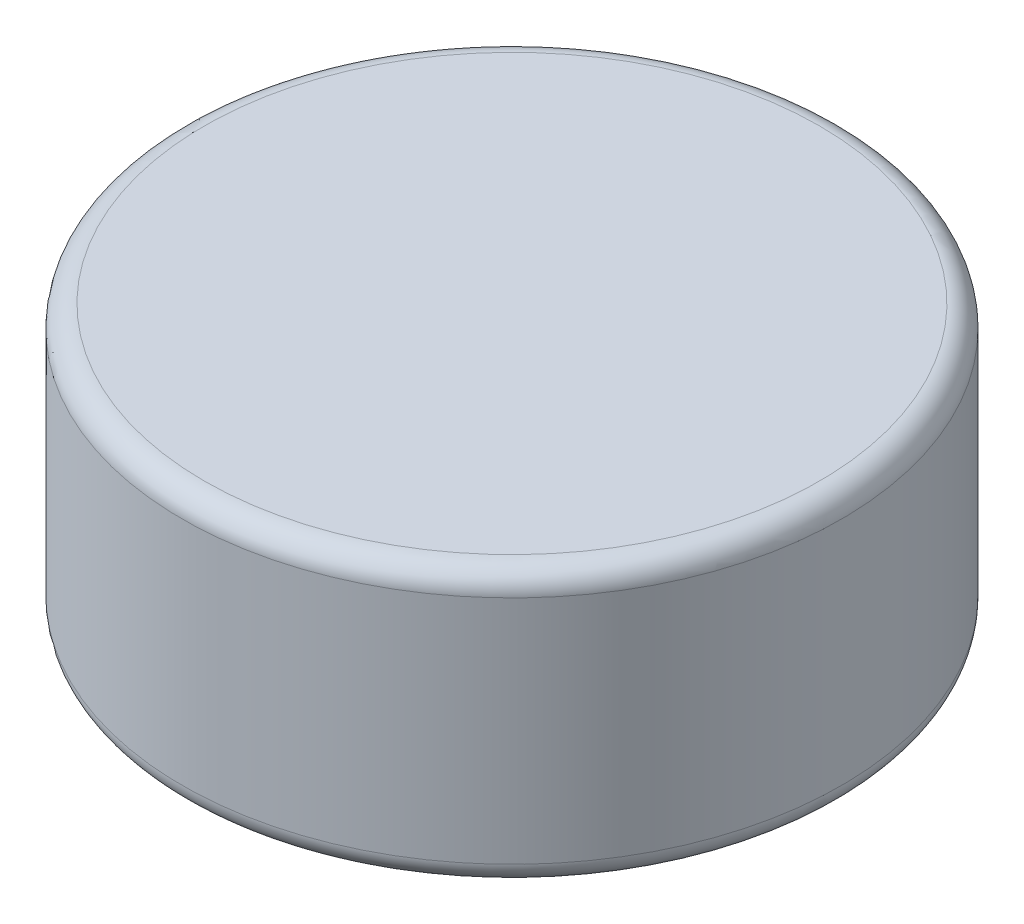
ISO-10303-21;
HEADER;
FILE_DESCRIPTION(('STEP AP214'),'2;1');
FILE_NAME('part.step','',(''),(''),'','','');
FILE_SCHEMA(('AUTOMOTIVE_DESIGN { 1 0 10303 214 1 1 1 1 }'));
ENDSEC;
DATA;
#1=APPLICATION_CONTEXT('core data for automotive mechanical design processes');
#2=APPLICATION_PROTOCOL_DEFINITION('international standard','automotive_design',2000,#1);
#3=PRODUCT_CONTEXT('',#1,'mechanical');
#4=PRODUCT('Part','Part','',(#3));
#5=PRODUCT_RELATED_PRODUCT_CATEGORY('part','',(#4));
#6=PRODUCT_DEFINITION_FORMATION('','',#4);
#7=PRODUCT_DEFINITION_CONTEXT('part definition',#1,'design');
#8=PRODUCT_DEFINITION('design','',#6,#7);
#9=PRODUCT_DEFINITION_SHAPE('','',#8);
#10=(LENGTH_UNIT() NAMED_UNIT(*) SI_UNIT(.MILLI.,.METRE.));
#11=(NAMED_UNIT(*) PLANE_ANGLE_UNIT() SI_UNIT($,.RADIAN.));
#12=(NAMED_UNIT(*) SI_UNIT($,.STERADIAN.) SOLID_ANGLE_UNIT());
#13=UNCERTAINTY_MEASURE_WITH_UNIT(LENGTH_MEASURE(1.E-05),#10,'distance_accuracy_value','');
#14=(GEOMETRIC_REPRESENTATION_CONTEXT(3) GLOBAL_UNCERTAINTY_ASSIGNED_CONTEXT((#13)) GLOBAL_UNIT_ASSIGNED_CONTEXT((#10,
#11,#12)) REPRESENTATION_CONTEXT('',''));
#15=CARTESIAN_POINT('',(0.,0.,0.));
#16=DIRECTION('',(0.,0.,1.));
#17=DIRECTION('',(1.,0.,0.));
#18=AXIS2_PLACEMENT_3D('',#15,#16,#17);
#19=CARTESIAN_POINT('',(0.,1.05,0.));
#20=DIRECTION('',(0.,-1.,0.));
#21=DIRECTION('',(0.,0.,-1.));
#22=AXIS2_PLACEMENT_3D('',#19,#20,#21);
#23=TOROIDAL_SURFACE('',#22,2.8,0.2);
#24=CARTESIAN_POINT('',(0.,1.25,0.));
#25=DIRECTION('',(0.,-1.,0.));
#26=DIRECTION('',(0.,0.,-1.));
#27=AXIS2_PLACEMENT_3D('',#24,#25,#26);
#28=CIRCLE('',#27,2.8);
#29=CARTESIAN_POINT('',(0.,1.25,-2.8));
#30=VERTEX_POINT('',#29);
#31=EDGE_CURVE('E10',#30,#30,#28,.T.);
#32=ORIENTED_EDGE('',*,*,#31,.T.);
#33=EDGE_LOOP('',(#32));
#34=FACE_BOUND('',#33,.T.);
#35=CARTESIAN_POINT('',(0.,1.05,0.));
#36=DIRECTION('',(0.,-1.,0.));
#37=DIRECTION('',(0.,0.,-1.));
#38=AXIS2_PLACEMENT_3D('',#35,#36,#37);
#39=CIRCLE('',#38,3.);
#40=CARTESIAN_POINT('',(0.,1.05,-3.));
#41=VERTEX_POINT('',#40);
#42=EDGE_CURVE('E44',#41,#41,#39,.T.);
#43=ORIENTED_EDGE('',*,*,#42,.F.);
#44=EDGE_LOOP('',(#43));
#45=FACE_BOUND('',#44,.T.);
#46=ADVANCED_FACE('F30',(#34,#45),#23,.T.);
#47=CARTESIAN_POINT('',(2.8,1.25,0.));
#48=DIRECTION('',(0.,1.,0.));
#49=DIRECTION('',(0.,0.,1.));
#50=AXIS2_PLACEMENT_3D('',#47,#48,#49);
#51=PLANE('',#50);
#52=ORIENTED_EDGE('',*,*,#31,.F.);
#53=EDGE_LOOP('',(#52));
#54=FACE_BOUND('',#53,.T.);
#55=ADVANCED_FACE('F54',(#54),#51,.T.);
#56=CARTESIAN_POINT('',(0.,-1.25,0.));
#57=DIRECTION('',(0.,-1.,0.));
#58=DIRECTION('',(0.,0.,-1.));
#59=AXIS2_PLACEMENT_3D('',#56,#57,#58);
#60=PLANE('',#59);
#61=CARTESIAN_POINT('',(0.,-1.25,0.));
#62=DIRECTION('',(0.,-1.,0.));
#63=DIRECTION('',(0.,0.,-1.));
#64=AXIS2_PLACEMENT_3D('',#61,#62,#63);
#65=CIRCLE('',#64,2.8);
#66=CARTESIAN_POINT('',(0.,-1.25,-2.8));
#67=VERTEX_POINT('',#66);
#68=EDGE_CURVE('E36',#67,#67,#65,.T.);
#69=ORIENTED_EDGE('',*,*,#68,.T.);
#70=EDGE_LOOP('',(#69));
#71=FACE_BOUND('',#70,.T.);
#72=ADVANCED_FACE('F58',(#71),#60,.T.);
#73=CARTESIAN_POINT('',(0.,-1.05,0.));
#74=DIRECTION('',(0.,-1.,0.));
#75=DIRECTION('',(0.,0.,-1.));
#76=AXIS2_PLACEMENT_3D('',#73,#74,#75);
#77=TOROIDAL_SURFACE('',#76,2.8,0.2);
#78=CARTESIAN_POINT('',(0.,-1.05,0.));
#79=DIRECTION('',(0.,-1.,0.));
#80=DIRECTION('',(0.,0.,-1.));
#81=AXIS2_PLACEMENT_3D('',#78,#79,#80);
#82=CIRCLE('',#81,3.);
#83=CARTESIAN_POINT('',(0.,-1.05,-3.));
#84=VERTEX_POINT('',#83);
#85=EDGE_CURVE('E40',#84,#84,#82,.T.);
#86=ORIENTED_EDGE('',*,*,#85,.T.);
#87=EDGE_LOOP('',(#86));
#88=FACE_BOUND('',#87,.T.);
#89=ORIENTED_EDGE('',*,*,#68,.F.);
#90=EDGE_LOOP('',(#89));
#91=FACE_BOUND('',#90,.T.);
#92=ADVANCED_FACE('F63',(#88,#91),#77,.T.);
#93=CARTESIAN_POINT('',(0.,1.25,0.));
#94=DIRECTION('',(0.,-1.,0.));
#95=DIRECTION('',(0.,0.,-1.));
#96=AXIS2_PLACEMENT_3D('',#93,#94,#95);
#97=CYLINDRICAL_SURFACE('',#96,3.);
#98=ORIENTED_EDGE('',*,*,#42,.T.);
#99=EDGE_LOOP('',(#98));
#100=FACE_BOUND('',#99,.T.);
#101=ORIENTED_EDGE('',*,*,#85,.F.);
#102=EDGE_LOOP('',(#101));
#103=FACE_BOUND('',#102,.T.);
#104=ADVANCED_FACE('F50',(#100,#103),#97,.T.);
#105=CLOSED_SHELL('',(#46,#55,#72,#92,#104));
#106=MANIFOLD_SOLID_BREP('B2',#105);
#107=ADVANCED_BREP_SHAPE_REPRESENTATION('',(#18,#106),#14);
#108=SHAPE_DEFINITION_REPRESENTATION(#9,#107);
ENDSEC;
END-ISO-10303-21;
